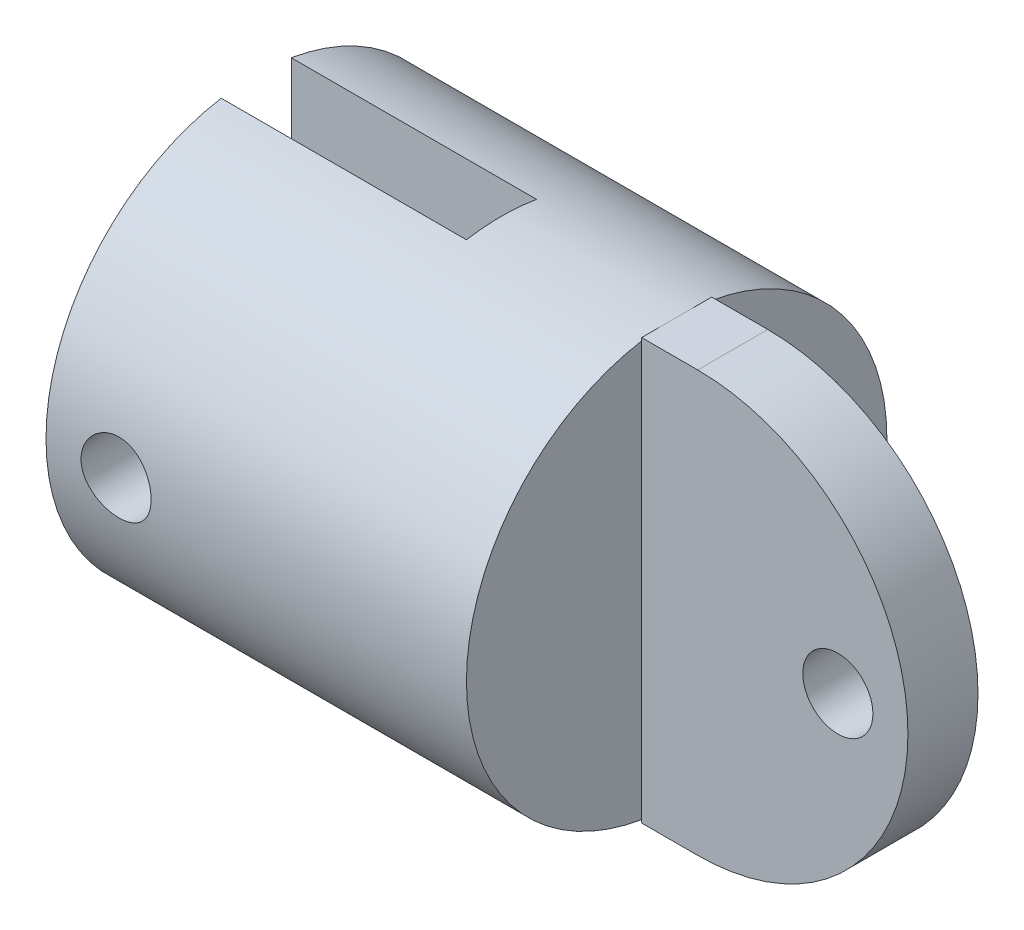
ISO-10303-21;
HEADER;
FILE_DESCRIPTION(('STEP AP214'),'2;1');
FILE_NAME('part.step','',(''),(''),'','','');
FILE_SCHEMA(('AUTOMOTIVE_DESIGN { 1 0 10303 214 1 1 1 1 }'));
ENDSEC;
DATA;
#1=APPLICATION_CONTEXT('core data for automotive mechanical design processes');
#2=APPLICATION_PROTOCOL_DEFINITION('international standard','automotive_design',2000,#1);
#3=PRODUCT_CONTEXT('',#1,'mechanical');
#4=PRODUCT('Part','Part','',(#3));
#5=PRODUCT_RELATED_PRODUCT_CATEGORY('part','',(#4));
#6=PRODUCT_DEFINITION_FORMATION('','',#4);
#7=PRODUCT_DEFINITION_CONTEXT('part definition',#1,'design');
#8=PRODUCT_DEFINITION('design','',#6,#7);
#9=PRODUCT_DEFINITION_SHAPE('','',#8);
#10=(LENGTH_UNIT() NAMED_UNIT(*) SI_UNIT(.MILLI.,.METRE.));
#11=(NAMED_UNIT(*) PLANE_ANGLE_UNIT() SI_UNIT($,.RADIAN.));
#12=(NAMED_UNIT(*) SI_UNIT($,.STERADIAN.) SOLID_ANGLE_UNIT());
#13=UNCERTAINTY_MEASURE_WITH_UNIT(LENGTH_MEASURE(1.E-05),#10,'distance_accuracy_value','');
#14=(GEOMETRIC_REPRESENTATION_CONTEXT(3) GLOBAL_UNCERTAINTY_ASSIGNED_CONTEXT((#13)) GLOBAL_UNIT_ASSIGNED_CONTEXT((#10,
#11,#12)) REPRESENTATION_CONTEXT('',''));
#15=CARTESIAN_POINT('',(0.,0.,0.));
#16=DIRECTION('',(0.,0.,1.));
#17=DIRECTION('',(1.,0.,0.));
#18=AXIS2_PLACEMENT_3D('',#15,#16,#17);
#19=CARTESIAN_POINT('',(0.,0.,0.));
#20=DIRECTION('',(1.,0.,0.));
#21=DIRECTION('',(0.,0.,-1.));
#22=AXIS2_PLACEMENT_3D('',#19,#20,#21);
#23=PLANE('',#22);
#24=DIRECTION('',(0.,1.,0.));
#25=VECTOR('',#24,1.);
#26=CARTESIAN_POINT('',(0.,15.,-2.5));
#27=LINE('',#26,#25);
#28=CARTESIAN_POINT('',(0.,-14.790199457749,-2.5));
#29=VERTEX_POINT('',#28);
#30=CARTESIAN_POINT('',(0.,14.790199457749,-2.5));
#31=VERTEX_POINT('',#30);
#32=EDGE_CURVE('E11',#29,#31,#27,.T.);
#33=ORIENTED_EDGE('',*,*,#32,.F.);
#34=CARTESIAN_POINT('',(0.,0.,0.));
#35=DIRECTION('',(1.,0.,0.));
#36=DIRECTION('',(0.,0.,-1.));
#37=AXIS2_PLACEMENT_3D('',#34,#35,#36);
#38=CIRCLE('',#37,15.);
#39=EDGE_CURVE('E272',#29,#31,#38,.T.);
#40=ORIENTED_EDGE('',*,*,#39,.T.);
#41=EDGE_LOOP('',(#33,#40));
#42=FACE_BOUND('',#41,.T.);
#43=ADVANCED_FACE('F39',(#42),#23,.T.);
#44=CARTESIAN_POINT('',(-30.,0.,0.));
#45=DIRECTION('',(1.,0.,0.));
#46=DIRECTION('',(0.,0.,-1.));
#47=AXIS2_PLACEMENT_3D('',#44,#45,#46);
#48=PLANE('',#47);
#49=CARTESIAN_POINT('',(-30.,0.,0.));
#50=DIRECTION('',(1.,0.,0.));
#51=DIRECTION('',(0.,0.,-1.));
#52=AXIS2_PLACEMENT_3D('',#49,#50,#51);
#53=CIRCLE('',#52,15.);
#54=CARTESIAN_POINT('',(-30.,-14.790199457749,-2.5));
#55=VERTEX_POINT('',#54);
#56=CARTESIAN_POINT('',(-30.,14.790199457749,-2.5));
#57=VERTEX_POINT('',#56);
#58=EDGE_CURVE('E256',#55,#57,#53,.T.);
#59=ORIENTED_EDGE('',*,*,#58,.F.);
#60=DIRECTION('',(0.,1.,0.));
#61=VECTOR('',#60,1.);
#62=CARTESIAN_POINT('',(-30.,0.,-2.5));
#63=LINE('',#62,#61);
#64=EDGE_CURVE('E257',#55,#57,#63,.T.);
#65=ORIENTED_EDGE('',*,*,#64,.T.);
#66=EDGE_LOOP('',(#59,#65));
#67=FACE_BOUND('',#66,.T.);
#68=ADVANCED_FACE('F236',(#67),#48,.F.);
#69=CARTESIAN_POINT('',(-30.,0.,0.));
#70=DIRECTION('',(1.,0.,0.));
#71=DIRECTION('',(0.,0.,-1.));
#72=AXIS2_PLACEMENT_3D('',#69,#70,#71);
#73=CYLINDRICAL_SURFACE('',#72,15.);
#74=CARTESIAN_POINT('',(-22.5,0.,-15.));
#75=CARTESIAN_POINT('',(-22.5000055889478,-0.139390904958215,-14.9999976116882));
#76=CARTESIAN_POINT('',(-22.5116972749689,-0.278857881838821,-14.9980367791303));
#77=CARTESIAN_POINT('',(-22.5581356587653,-0.553880221673043,-14.9904034494139));
#78=CARTESIAN_POINT('',(-22.5929035569116,-0.689431867959247,-14.9847275392389));
#79=CARTESIAN_POINT('',(-22.6844154485927,-0.952604747212644,-14.9703006823645));
#80=CARTESIAN_POINT('',(-22.7411414656406,-1.0802323684319,-14.9615522515919));
#81=CARTESIAN_POINT('',(-22.8749122920524,-1.32414184197794,-14.9419422708207));
#82=CARTESIAN_POINT('',(-22.951954777483,-1.44042498987859,-14.9310809625443));
#83=CARTESIAN_POINT('',(-23.1249550838205,-1.65947261429168,-14.9083331745831));
#84=CARTESIAN_POINT('',(-23.2210691146361,-1.76211290353497,-14.8964387181486));
#85=CARTESIAN_POINT('',(-23.4291479684728,-1.94988849865993,-14.8730262687673));
#86=CARTESIAN_POINT('',(-23.5411137914566,-2.03502269939097,-14.8615082996267));
#87=CARTESIAN_POINT('',(-23.7785709661971,-2.18586712560514,-14.8400756575978));
#88=CARTESIAN_POINT('',(-23.9041413368048,-2.251454552861,-14.8301712909164));
#89=CARTESIAN_POINT('',(-24.1647095643006,-2.36055836541122,-14.8131978979467));
#90=CARTESIAN_POINT('',(-24.2997067836776,-2.40407624156561,-14.8061286801431));
#91=CARTESIAN_POINT('',(-24.5739802748565,-2.46741437778481,-14.7957053684276));
#92=CARTESIAN_POINT('',(-24.7132057365014,-2.4874490291354,-14.792317684857));
#93=CARTESIAN_POINT('',(-24.9930802768835,-2.50391672528988,-14.7895393893665));
#94=CARTESIAN_POINT('',(-25.1337292541673,-2.500351440389,-14.7901484945721));
#95=CARTESIAN_POINT('',(-25.4109278612754,-2.46989509839615,-14.7952642886356));
#96=CARTESIAN_POINT('',(-25.5475048035452,-2.44324488188978,-14.7997307331892));
#97=CARTESIAN_POINT('',(-25.8142213178291,-2.36775314040345,-14.8119949521101));
#98=CARTESIAN_POINT('',(-25.9443606688885,-2.31891085431974,-14.8197928407327));
#99=CARTESIAN_POINT('',(-26.1952288234409,-2.20017724609391,-14.837884793341));
#100=CARTESIAN_POINT('',(-26.3159094060812,-2.13018591387971,-14.8481906710733));
#101=CARTESIAN_POINT('',(-26.5439044005384,-1.97121201755743,-14.8701291841501));
#102=CARTESIAN_POINT('',(-26.6512177324549,-1.88222792065429,-14.8817619265429));
#103=CARTESIAN_POINT('',(-26.8508260858073,-1.68648221215905,-14.9052202787979));
#104=CARTESIAN_POINT('',(-26.9429185185401,-1.57951396387313,-14.9170464923165));
#105=CARTESIAN_POINT('',(-27.1078777626653,-1.35153524898165,-14.9394260139672));
#106=CARTESIAN_POINT('',(-27.1807444501832,-1.23052469190642,-14.9499793138975));
#107=CARTESIAN_POINT('',(-27.3052022271363,-0.977705916166714,-14.9686389289291));
#108=CARTESIAN_POINT('',(-27.3567754193313,-0.845888725564664,-14.9767431840745));
#109=CARTESIAN_POINT('',(-27.436994215246,-0.575298345602734,-14.9895750301266));
#110=CARTESIAN_POINT('',(-27.4656417369737,-0.43652573917947,-14.9943029035047));
#111=CARTESIAN_POINT('',(-27.4989213584611,-0.157709901301625,-14.9998112984269));
#112=CARTESIAN_POINT('',(-27.5038315718056,-0.0177007371510131,-15.0006375301278));
#113=CARTESIAN_POINT('',(-27.4902386555719,0.261139772889886,-14.9983747442117));
#114=CARTESIAN_POINT('',(-27.4717364268663,0.399971163892037,-14.9952858772412));
#115=CARTESIAN_POINT('',(-27.4120751506645,0.671656175546761,-14.985568269382));
#116=CARTESIAN_POINT('',(-27.3710537916099,0.804540868385377,-14.9789610480131));
#117=CARTESIAN_POINT('',(-27.2676654818005,1.06154688486044,-14.9629446445536));
#118=CARTESIAN_POINT('',(-27.2052973323647,1.18566771590972,-14.9535353051202));
#119=CARTESIAN_POINT('',(-27.0603488753032,1.42283068946896,-14.9328451630241));
#120=CARTESIAN_POINT('',(-26.9775948438327,1.53576525093715,-14.9215485588702));
#121=CARTESIAN_POINT('',(-26.7944626846149,1.74624358550269,-14.898384673919));
#122=CARTESIAN_POINT('',(-26.6940832767233,1.84378623969658,-14.8865173517155));
#123=CARTESIAN_POINT('',(-26.4773024519286,2.021742779658,-14.8634017523585));
#124=CARTESIAN_POINT('',(-26.3607458344856,2.10196876111371,-14.8521611613711));
#125=CARTESIAN_POINT('',(-26.1156470308615,2.24170231029498,-14.8317152977788));
#126=CARTESIAN_POINT('',(-25.9871052247725,2.30121053476982,-14.8225099606602));
#127=CARTESIAN_POINT('',(-25.7222102671879,2.39753833147315,-14.807234536977));
#128=CARTESIAN_POINT('',(-25.5858919049695,2.43445143254795,-14.8011515431106));
#129=CARTESIAN_POINT('',(-25.3088798707782,2.48483545377828,-14.7927771683526));
#130=CARTESIAN_POINT('',(-25.1681865802679,2.49830841194617,-14.7904854578272));
#131=CARTESIAN_POINT('',(-24.8882948340376,2.50137286604736,-14.7899673308401));
#132=CARTESIAN_POINT('',(-24.7490996214247,2.49126013612519,-14.7916905650565));
#133=CARTESIAN_POINT('',(-24.4744207519492,2.44807983895685,-14.7988978145373));
#134=CARTESIAN_POINT('',(-24.3389370830581,2.41501234611248,-14.8043818176121));
#135=CARTESIAN_POINT('',(-24.0756415627074,2.3269744895949,-14.8184735628172));
#136=CARTESIAN_POINT('',(-23.947820989944,2.27202959060044,-14.8270776721967));
#137=CARTESIAN_POINT('',(-23.7031643308051,2.14182700391591,-14.8464436892221));
#138=CARTESIAN_POINT('',(-23.5863287896279,2.06656830874857,-14.857205703884));
#139=CARTESIAN_POINT('',(-23.3654644168922,1.89681888437216,-14.8798345404562));
#140=CARTESIAN_POINT('',(-23.2616039832997,1.80211056359365,-14.891712955763));
#141=CARTESIAN_POINT('',(-23.0711483955251,1.59660903138023,-14.9151437236084));
#142=CARTESIAN_POINT('',(-22.9845572313618,1.48581211291264,-14.9266960002655));
#143=CARTESIAN_POINT('',(-22.8305517318,1.25036916964028,-14.9482652964222));
#144=CARTESIAN_POINT('',(-22.763273960687,1.12563278753282,-14.958271162531));
#145=CARTESIAN_POINT('',(-22.6507305153901,0.866513069378984,-14.9755116760178));
#146=CARTESIAN_POINT('',(-22.6054429189203,0.732139494830012,-14.9827490817748));
#147=CARTESIAN_POINT('',(-22.5479947258733,0.497703310045403,-14.9920579083296));
#148=CARTESIAN_POINT('',(-22.530025530384,0.39905883029845,-14.9950202727336));
#149=CARTESIAN_POINT('',(-22.5060262621552,0.200289310319811,-14.9989921598612));
#150=CARTESIAN_POINT('',(-22.4999959838626,0.100164295608495,-15.0000017162064));
#151=CARTESIAN_POINT('',(-22.5,0.,-15.));
#152=B_SPLINE_CURVE_WITH_KNOTS('',3,(#74,#75,#76,#77,#78,#79,#80,#81,#82,#83,#84,#85,#86,#87,
#88,#89,#90,#91,#92,#93,#94,#95,#96,#97,#98,#99,#100,#101,#102,#103,#104,#105,#106,#107,#108,
#109,#110,#111,#112,#113,#114,#115,#116,#117,#118,#119,#120,#121,#122,#123,#124,#125,#126,#127,
#128,#129,#130,#131,#132,#133,#134,#135,#136,#137,#138,#139,#140,#141,#142,#143,#144,#145,#146,
#147,#148,#149,#150,#151),.UNSPECIFIED.,.T.,.F.,(4,2,2,2,2,2,2,2,2,2,2,2,2,2,2,2,2,2,2,2,2,2,2,
2,2,2,2,2,2,2,2,2,2,2,2,2,2,2,4),(0.,0.41780658493851,0.835997545695421,1.25384686702527,
1.67164841267479,2.09302491062332,2.51442800169857,2.9384252082384,3.36239376876182,
3.78246077103424,4.20249804320887,4.61820521760409,5.03392665025382,5.45164556632558,
5.86939820680574,6.29232769911327,6.71525991635848,7.13854688915904,7.56179844521149,
7.98007883491398,8.3983431303586,8.81407807006416,9.22983635826067,9.64926825627025,
10.0687306305428,10.4925382200762,10.9163323737594,11.3383602234177,11.7603513778662,
12.177079095227,12.5938054618813,13.0100481822622,13.4263115502934,13.8475138419339,
14.2688133387897,14.693022316072,15.1168075213007,15.4170424816402,15.7172722727697),.UNSPECIFIED.);
#153=CARTESIAN_POINT('',(-22.5,0.,-15.));
#154=VERTEX_POINT('',#153);
#155=EDGE_CURVE('E204',#154,#154,#152,.T.);
#156=ORIENTED_EDGE('',*,*,#155,.F.);
#157=EDGE_LOOP('',(#156));
#158=FACE_BOUND('',#157,.T.);
#159=CARTESIAN_POINT('',(-22.5,0.,15.));
#160=CARTESIAN_POINT('',(-22.5000055889478,0.139390904958215,14.9999976116882));
#161=CARTESIAN_POINT('',(-22.5116972749689,0.278857881838821,14.9980367791303));
#162=CARTESIAN_POINT('',(-22.5581356587653,0.553880221673043,14.9904034494139));
#163=CARTESIAN_POINT('',(-22.5929035569116,0.689431867959247,14.9847275392389));
#164=CARTESIAN_POINT('',(-22.6844154485927,0.952604747212644,14.9703006823645));
#165=CARTESIAN_POINT('',(-22.7411414656406,1.0802323684319,14.9615522515919));
#166=CARTESIAN_POINT('',(-22.8749122920524,1.32414184197794,14.9419422708207));
#167=CARTESIAN_POINT('',(-22.951954777483,1.44042498987859,14.9310809625443));
#168=CARTESIAN_POINT('',(-23.1249550838205,1.65947261429168,14.9083331745831));
#169=CARTESIAN_POINT('',(-23.2210691146361,1.76211290353497,14.8964387181486));
#170=CARTESIAN_POINT('',(-23.4291479684728,1.94988849865993,14.8730262687673));
#171=CARTESIAN_POINT('',(-23.5411137914566,2.03502269939097,14.8615082996267));
#172=CARTESIAN_POINT('',(-23.7785709661971,2.18586712560514,14.8400756575978));
#173=CARTESIAN_POINT('',(-23.9041413368048,2.251454552861,14.8301712909164));
#174=CARTESIAN_POINT('',(-24.1647095643006,2.36055836541122,14.8131978979467));
#175=CARTESIAN_POINT('',(-24.2997067836776,2.40407624156561,14.8061286801431));
#176=CARTESIAN_POINT('',(-24.5739802748565,2.46741437778481,14.7957053684276));
#177=CARTESIAN_POINT('',(-24.7132057365014,2.4874490291354,14.792317684857));
#178=CARTESIAN_POINT('',(-24.9930802768835,2.50391672528988,14.7895393893665));
#179=CARTESIAN_POINT('',(-25.1337292541673,2.500351440389,14.7901484945721));
#180=CARTESIAN_POINT('',(-25.4109278612754,2.46989509839615,14.7952642886356));
#181=CARTESIAN_POINT('',(-25.5475048035452,2.44324488188978,14.7997307331892));
#182=CARTESIAN_POINT('',(-25.8142213178291,2.36775314040345,14.8119949521101));
#183=CARTESIAN_POINT('',(-25.9443606688885,2.31891085431974,14.8197928407327));
#184=CARTESIAN_POINT('',(-26.1952288234409,2.20017724609391,14.837884793341));
#185=CARTESIAN_POINT('',(-26.3159094060812,2.13018591387971,14.8481906710733));
#186=CARTESIAN_POINT('',(-26.5439044005384,1.97121201755743,14.8701291841501));
#187=CARTESIAN_POINT('',(-26.6512177324549,1.88222792065429,14.8817619265429));
#188=CARTESIAN_POINT('',(-26.8508260858073,1.68648221215905,14.9052202787979));
#189=CARTESIAN_POINT('',(-26.9429185185401,1.57951396387313,14.9170464923165));
#190=CARTESIAN_POINT('',(-27.1078777626653,1.35153524898165,14.9394260139672));
#191=CARTESIAN_POINT('',(-27.1807444501832,1.23052469190642,14.9499793138975));
#192=CARTESIAN_POINT('',(-27.3052022271363,0.977705916166714,14.9686389289291));
#193=CARTESIAN_POINT('',(-27.3567754193313,0.845888725564664,14.9767431840745));
#194=CARTESIAN_POINT('',(-27.436994215246,0.575298345602734,14.9895750301266));
#195=CARTESIAN_POINT('',(-27.4656417369737,0.43652573917947,14.9943029035047));
#196=CARTESIAN_POINT('',(-27.4989213584611,0.157709901301625,14.9998112984269));
#197=CARTESIAN_POINT('',(-27.5038315718056,0.0177007371510131,15.0006375301278));
#198=CARTESIAN_POINT('',(-27.4902386555719,-0.261139772889886,14.9983747442117));
#199=CARTESIAN_POINT('',(-27.4717364268663,-0.399971163892037,14.9952858772412));
#200=CARTESIAN_POINT('',(-27.4120751506645,-0.671656175546761,14.985568269382));
#201=CARTESIAN_POINT('',(-27.3710537916099,-0.804540868385377,14.9789610480131));
#202=CARTESIAN_POINT('',(-27.2676654818005,-1.06154688486044,14.9629446445536));
#203=CARTESIAN_POINT('',(-27.2052973323647,-1.18566771590972,14.9535353051202));
#204=CARTESIAN_POINT('',(-27.0603488753032,-1.42283068946896,14.9328451630241));
#205=CARTESIAN_POINT('',(-26.9775948438327,-1.53576525093715,14.9215485588702));
#206=CARTESIAN_POINT('',(-26.7944626846149,-1.74624358550269,14.898384673919));
#207=CARTESIAN_POINT('',(-26.6940832767233,-1.84378623969658,14.8865173517155));
#208=CARTESIAN_POINT('',(-26.4773024519286,-2.021742779658,14.8634017523585));
#209=CARTESIAN_POINT('',(-26.3607458344856,-2.10196876111371,14.8521611613711));
#210=CARTESIAN_POINT('',(-26.1156470308615,-2.24170231029498,14.8317152977788));
#211=CARTESIAN_POINT('',(-25.9871052247725,-2.30121053476982,14.8225099606602));
#212=CARTESIAN_POINT('',(-25.7222102671879,-2.39753833147315,14.807234536977));
#213=CARTESIAN_POINT('',(-25.5858919049695,-2.43445143254795,14.8011515431106));
#214=CARTESIAN_POINT('',(-25.3088798707782,-2.48483545377828,14.7927771683526));
#215=CARTESIAN_POINT('',(-25.1681865802679,-2.49830841194617,14.7904854578272));
#216=CARTESIAN_POINT('',(-24.8882948340376,-2.50137286604736,14.7899673308401));
#217=CARTESIAN_POINT('',(-24.7490996214247,-2.49126013612519,14.7916905650565));
#218=CARTESIAN_POINT('',(-24.4744207519492,-2.44807983895685,14.7988978145373));
#219=CARTESIAN_POINT('',(-24.3389370830581,-2.41501234611248,14.8043818176121));
#220=CARTESIAN_POINT('',(-24.0756415627074,-2.3269744895949,14.8184735628172));
#221=CARTESIAN_POINT('',(-23.947820989944,-2.27202959060044,14.8270776721967));
#222=CARTESIAN_POINT('',(-23.7031643308051,-2.14182700391591,14.8464436892221));
#223=CARTESIAN_POINT('',(-23.5863287896279,-2.06656830874857,14.857205703884));
#224=CARTESIAN_POINT('',(-23.3654644168922,-1.89681888437216,14.8798345404562));
#225=CARTESIAN_POINT('',(-23.2616039832997,-1.80211056359365,14.891712955763));
#226=CARTESIAN_POINT('',(-23.0711483955251,-1.59660903138023,14.9151437236084));
#227=CARTESIAN_POINT('',(-22.9845572313618,-1.48581211291264,14.9266960002655));
#228=CARTESIAN_POINT('',(-22.8305517318,-1.25036916964028,14.9482652964222));
#229=CARTESIAN_POINT('',(-22.763273960687,-1.12563278753282,14.958271162531));
#230=CARTESIAN_POINT('',(-22.6507305153901,-0.866513069378984,14.9755116760178));
#231=CARTESIAN_POINT('',(-22.6054429189203,-0.732139494830012,14.9827490817748));
#232=CARTESIAN_POINT('',(-22.5479947258733,-0.497703310045403,14.9920579083296));
#233=CARTESIAN_POINT('',(-22.530025530384,-0.39905883029845,14.9950202727336));
#234=CARTESIAN_POINT('',(-22.5060262621552,-0.200289310319811,14.9989921598612));
#235=CARTESIAN_POINT('',(-22.4999959838626,-0.100164295608495,15.0000017162064));
#236=CARTESIAN_POINT('',(-22.5,0.,15.));
#237=B_SPLINE_CURVE_WITH_KNOTS('',3,(#159,#160,#161,#162,#163,#164,#165,#166,#167,#168,#169,
#170,#171,#172,#173,#174,#175,#176,#177,#178,#179,#180,#181,#182,#183,#184,#185,#186,#187,#188,
#189,#190,#191,#192,#193,#194,#195,#196,#197,#198,#199,#200,#201,#202,#203,#204,#205,#206,#207,
#208,#209,#210,#211,#212,#213,#214,#215,#216,#217,#218,#219,#220,#221,#222,#223,#224,#225,#226,
#227,#228,#229,#230,#231,#232,#233,#234,#235,#236),.UNSPECIFIED.,.T.,.F.,(4,2,2,2,2,2,2,2,2,2,2,
2,2,2,2,2,2,2,2,2,2,2,2,2,2,2,2,2,2,2,2,2,2,2,2,2,2,2,4),(0.,0.41780658493851,0.835997545695421,
1.25384686702527,1.67164841267479,2.09302491062332,2.51442800169857,2.9384252082384,
3.36239376876182,3.78246077103424,4.20249804320887,4.61820521760409,5.03392665025382,
5.45164556632558,5.86939820680574,6.29232769911327,6.71525991635848,7.13854688915904,
7.56179844521149,7.98007883491398,8.3983431303586,8.81407807006416,9.22983635826067,
9.64926825627025,10.0687306305428,10.4925382200762,10.9163323737594,11.3383602234177,
11.7603513778662,12.177079095227,12.5938054618813,13.0100481822622,13.4263115502934,
13.8475138419339,14.2688133387897,14.693022316072,15.1168075213007,15.4170424816402,
15.7172722727697),.UNSPECIFIED.);
#238=CARTESIAN_POINT('',(-22.5,0.,15.));
#239=VERTEX_POINT('',#238);
#240=EDGE_CURVE('E196',#239,#239,#237,.T.);
#241=ORIENTED_EDGE('',*,*,#240,.F.);
#242=EDGE_LOOP('',(#241));
#243=FACE_BOUND('',#242,.T.);
#244=DIRECTION('',(1.,0.,0.));
#245=VECTOR('',#244,1.);
#246=CARTESIAN_POINT('',(-30.,-14.790199457749,-2.5));
#247=LINE('',#246,#245);
#248=CARTESIAN_POINT('',(-12.5,-14.790199457749,-2.5));
#249=VERTEX_POINT('',#248);
#250=EDGE_CURVE('E297',#55,#249,#247,.T.);
#251=ORIENTED_EDGE('',*,*,#250,.F.);
#252=ORIENTED_EDGE('',*,*,#58,.T.);
#253=DIRECTION('',(1.,0.,0.));
#254=VECTOR('',#253,1.);
#255=CARTESIAN_POINT('',(-30.,14.790199457749,-2.5));
#256=LINE('',#255,#254);
#257=CARTESIAN_POINT('',(-12.5,14.790199457749,-2.5));
#258=VERTEX_POINT('',#257);
#259=EDGE_CURVE('E274',#258,#57,#256,.F.);
#260=ORIENTED_EDGE('',*,*,#259,.F.);
#261=CARTESIAN_POINT('',(-12.5,0.,0.));
#262=DIRECTION('',(1.,0.,0.));
#263=DIRECTION('',(0.,0.,-1.));
#264=AXIS2_PLACEMENT_3D('',#261,#262,#263);
#265=CIRCLE('',#264,15.);
#266=CARTESIAN_POINT('',(-12.5,14.790199457749,2.5));
#267=VERTEX_POINT('',#266);
#268=EDGE_CURVE('E282',#267,#258,#265,.F.);
#269=ORIENTED_EDGE('',*,*,#268,.F.);
#270=DIRECTION('',(1.,0.,0.));
#271=VECTOR('',#270,1.);
#272=CARTESIAN_POINT('',(-30.,14.790199457749,2.5));
#273=LINE('',#272,#271);
#274=CARTESIAN_POINT('',(-30.,14.790199457749,2.5));
#275=VERTEX_POINT('',#274);
#276=EDGE_CURVE('E324',#275,#267,#273,.T.);
#277=ORIENTED_EDGE('',*,*,#276,.F.);
#278=CARTESIAN_POINT('',(-30.,-14.790199457749,2.5));
#279=VERTEX_POINT('',#278);
#280=EDGE_CURVE('E262',#275,#279,#53,.T.);
#281=ORIENTED_EDGE('',*,*,#280,.T.);
#282=DIRECTION('',(1.,0.,0.));
#283=VECTOR('',#282,1.);
#284=CARTESIAN_POINT('',(-30.,-14.790199457749,2.5));
#285=LINE('',#284,#283);
#286=CARTESIAN_POINT('',(-12.5,-14.790199457749,2.5));
#287=VERTEX_POINT('',#286);
#288=EDGE_CURVE('E321',#287,#279,#285,.F.);
#289=ORIENTED_EDGE('',*,*,#288,.F.);
#290=EDGE_CURVE('E284',#249,#287,#265,.F.);
#291=ORIENTED_EDGE('',*,*,#290,.F.);
#292=EDGE_LOOP('',(#251,#252,#260,#269,#277,#281,#289,#291));
#293=FACE_BOUND('',#292,.T.);
#294=CARTESIAN_POINT('',(0.,15.,0.));
#295=VERTEX_POINT('',#294);
#296=EDGE_CURVE('E263',#31,#295,#38,.T.);
#297=ORIENTED_EDGE('',*,*,#296,.F.);
#298=ORIENTED_EDGE('',*,*,#39,.F.);
#299=CARTESIAN_POINT('',(0.,-15.,0.));
#300=VERTEX_POINT('',#299);
#301=EDGE_CURVE('E64',#300,#29,#38,.T.);
#302=ORIENTED_EDGE('',*,*,#301,.F.);
#303=CARTESIAN_POINT('',(0.,-14.790199457749,2.5));
#304=VERTEX_POINT('',#303);
#305=EDGE_CURVE('E313',#304,#300,#38,.T.);
#306=ORIENTED_EDGE('',*,*,#305,.F.);
#307=CARTESIAN_POINT('',(0.,14.790199457749,2.5));
#308=VERTEX_POINT('',#307);
#309=EDGE_CURVE('E316',#308,#304,#38,.T.);
#310=ORIENTED_EDGE('',*,*,#309,.F.);
#311=EDGE_CURVE('E270',#295,#308,#38,.T.);
#312=ORIENTED_EDGE('',*,*,#311,.F.);
#313=EDGE_LOOP('',(#297,#298,#302,#306,#310,#312));
#314=FACE_BOUND('',#313,.T.);
#315=ADVANCED_FACE('F41',(#158,#243,#293,#314),#73,.T.);
#316=ORIENTED_EDGE('',*,*,#280,.F.);
#317=DIRECTION('',(0.,-1.,0.));
#318=VECTOR('',#317,1.);
#319=CARTESIAN_POINT('',(-30.,0.,2.5));
#320=LINE('',#319,#318);
#321=EDGE_CURVE('E268',#275,#279,#320,.T.);
#322=ORIENTED_EDGE('',*,*,#321,.T.);
#323=EDGE_LOOP('',(#316,#322));
#324=FACE_BOUND('',#323,.T.);
#325=ADVANCED_FACE('F233',(#324),#48,.F.);
#326=DIRECTION('',(0.,-1.,0.));
#327=VECTOR('',#326,1.);
#328=CARTESIAN_POINT('',(0.,15.,2.5));
#329=LINE('',#328,#327);
#330=EDGE_CURVE('E50',#308,#304,#329,.T.);
#331=ORIENTED_EDGE('',*,*,#330,.F.);
#332=ORIENTED_EDGE('',*,*,#309,.T.);
#333=EDGE_LOOP('',(#331,#332));
#334=FACE_BOUND('',#333,.T.);
#335=ADVANCED_FACE('F224',(#334),#23,.T.);
#336=CARTESIAN_POINT('',(-30.,-15.,-2.5));
#337=DIRECTION('',(0.,0.,-1.));
#338=DIRECTION('',(-1.,0.,0.));
#339=AXIS2_PLACEMENT_3D('',#336,#337,#338);
#340=PLANE('',#339);
#341=CARTESIAN_POINT('',(-25.,0.,-2.5));
#342=DIRECTION('',(0.,0.,-1.));
#343=DIRECTION('',(-1.,0.,0.));
#344=AXIS2_PLACEMENT_3D('',#341,#342,#343);
#345=CIRCLE('',#344,2.5);
#346=CARTESIAN_POINT('',(-27.5,0.,-2.5));
#347=VERTEX_POINT('',#346);
#348=EDGE_CURVE('E192',#347,#347,#345,.T.);
#349=ORIENTED_EDGE('',*,*,#348,.T.);
#350=EDGE_LOOP('',(#349));
#351=FACE_BOUND('',#350,.T.);
#352=ORIENTED_EDGE('',*,*,#259,.T.);
#353=ORIENTED_EDGE('',*,*,#64,.F.);
#354=ORIENTED_EDGE('',*,*,#250,.T.);
#355=DIRECTION('',(0.,1.,0.));
#356=VECTOR('',#355,1.);
#357=CARTESIAN_POINT('',(-12.5,-15.,-2.5));
#358=LINE('',#357,#356);
#359=EDGE_CURVE('E330',#249,#258,#358,.T.);
#360=ORIENTED_EDGE('',*,*,#359,.T.);
#361=EDGE_LOOP('',(#352,#353,#354,#360));
#362=FACE_BOUND('',#361,.T.);
#363=ADVANCED_FACE('F219',(#351,#362),#340,.F.);
#364=CARTESIAN_POINT('',(-12.5,-15.,-2.5));
#365=DIRECTION('',(1.,0.,0.));
#366=DIRECTION('',(0.,0.,-1.));
#367=AXIS2_PLACEMENT_3D('',#364,#365,#366);
#368=PLANE('',#367);
#369=ORIENTED_EDGE('',*,*,#359,.F.);
#370=ORIENTED_EDGE('',*,*,#290,.T.);
#371=DIRECTION('',(0.,1.,0.));
#372=VECTOR('',#371,1.);
#373=CARTESIAN_POINT('',(-12.5,-15.,2.5));
#374=LINE('',#373,#372);
#375=EDGE_CURVE('E331',#287,#267,#374,.T.);
#376=ORIENTED_EDGE('',*,*,#375,.T.);
#377=ORIENTED_EDGE('',*,*,#268,.T.);
#378=EDGE_LOOP('',(#369,#370,#376,#377));
#379=FACE_BOUND('',#378,.T.);
#380=ADVANCED_FACE('F223',(#379),#368,.F.);
#381=CARTESIAN_POINT('',(-30.,-15.,2.5));
#382=DIRECTION('',(0.,0.,1.));
#383=DIRECTION('',(1.,0.,0.));
#384=AXIS2_PLACEMENT_3D('',#381,#382,#383);
#385=PLANE('',#384);
#386=CARTESIAN_POINT('',(-25.,0.,2.5));
#387=DIRECTION('',(0.,0.,1.));
#388=DIRECTION('',(1.,0.,0.));
#389=AXIS2_PLACEMENT_3D('',#386,#387,#388);
#390=CIRCLE('',#389,2.5);
#391=CARTESIAN_POINT('',(-22.5,0.,2.5));
#392=VERTEX_POINT('',#391);
#393=EDGE_CURVE('E191',#392,#392,#390,.T.);
#394=ORIENTED_EDGE('',*,*,#393,.T.);
#395=EDGE_LOOP('',(#394));
#396=FACE_BOUND('',#395,.T.);
#397=ORIENTED_EDGE('',*,*,#288,.T.);
#398=ORIENTED_EDGE('',*,*,#321,.F.);
#399=ORIENTED_EDGE('',*,*,#276,.T.);
#400=ORIENTED_EDGE('',*,*,#375,.F.);
#401=EDGE_LOOP('',(#397,#398,#399,#400));
#402=FACE_BOUND('',#401,.T.);
#403=ADVANCED_FACE('F228',(#396,#402),#385,.F.);
#404=CARTESIAN_POINT('',(-25.,0.,-15.));
#405=DIRECTION('',(0.,0.,1.));
#406=DIRECTION('',(1.,0.,0.));
#407=AXIS2_PLACEMENT_3D('',#404,#405,#406);
#408=CYLINDRICAL_SURFACE('',#407,2.5);
#409=ORIENTED_EDGE('',*,*,#240,.T.);
#410=EDGE_LOOP('',(#409));
#411=FACE_BOUND('',#410,.T.);
#412=ORIENTED_EDGE('',*,*,#393,.F.);
#413=EDGE_LOOP('',(#412));
#414=FACE_BOUND('',#413,.T.);
#415=ADVANCED_FACE('F215',(#411,#414),#408,.F.);
#416=ORIENTED_EDGE('',*,*,#155,.T.);
#417=EDGE_LOOP('',(#416));
#418=FACE_BOUND('',#417,.T.);
#419=ORIENTED_EDGE('',*,*,#348,.F.);
#420=EDGE_LOOP('',(#419));
#421=FACE_BOUND('',#420,.T.);
#422=ADVANCED_FACE('F209',(#418,#421),#408,.F.);
#423=CARTESIAN_POINT('',(0.,0.,0.));
#424=DIRECTION('',(-1.,0.,0.));
#425=DIRECTION('',(0.,0.,1.));
#426=AXIS2_PLACEMENT_3D('',#423,#424,#425);
#427=PLANE('',#426);
#428=CARTESIAN_POINT('',(0.,15.,-2.5));
#429=VERTEX_POINT('',#428);
#430=EDGE_CURVE('E53',#31,#429,#27,.T.);
#431=ORIENTED_EDGE('',*,*,#430,.F.);
#432=ORIENTED_EDGE('',*,*,#296,.T.);
#433=DIRECTION('',(0.,0.,1.));
#434=VECTOR('',#433,1.);
#435=CARTESIAN_POINT('',(0.,15.,2.5));
#436=LINE('',#435,#434);
#437=EDGE_CURVE('E171',#429,#295,#436,.T.);
#438=ORIENTED_EDGE('',*,*,#437,.F.);
#439=EDGE_LOOP('',(#431,#432,#438));
#440=FACE_BOUND('',#439,.T.);
#441=ADVANCED_FACE('F214',(#440),#427,.T.);
#442=CARTESIAN_POINT('',(0.,15.,2.5));
#443=VERTEX_POINT('',#442);
#444=EDGE_CURVE('E164',#295,#443,#436,.T.);
#445=ORIENTED_EDGE('',*,*,#444,.F.);
#446=ORIENTED_EDGE('',*,*,#311,.T.);
#447=EDGE_CURVE('E175',#443,#308,#329,.T.);
#448=ORIENTED_EDGE('',*,*,#447,.F.);
#449=EDGE_LOOP('',(#445,#446,#448));
#450=FACE_BOUND('',#449,.T.);
#451=ADVANCED_FACE('F347',(#450),#427,.T.);
#452=CARTESIAN_POINT('',(0.,-15.,2.5));
#453=VERTEX_POINT('',#452);
#454=EDGE_CURVE('E151',#304,#453,#329,.T.);
#455=ORIENTED_EDGE('',*,*,#454,.F.);
#456=ORIENTED_EDGE('',*,*,#305,.T.);
#457=DIRECTION('',(0.,0.,-1.));
#458=VECTOR('',#457,1.);
#459=CARTESIAN_POINT('',(0.,-15.,2.5));
#460=LINE('',#459,#458);
#461=EDGE_CURVE('E179',#453,#300,#460,.T.);
#462=ORIENTED_EDGE('',*,*,#461,.F.);
#463=EDGE_LOOP('',(#455,#456,#462));
#464=FACE_BOUND('',#463,.T.);
#465=ADVANCED_FACE('F351',(#464),#427,.T.);
#466=CARTESIAN_POINT('',(4.,15.,2.5));
#467=DIRECTION('',(0.,-1.,0.));
#468=DIRECTION('',(0.,0.,-1.));
#469=AXIS2_PLACEMENT_3D('',#466,#467,#468);
#470=PLANE('',#469);
#471=ORIENTED_EDGE('',*,*,#437,.T.);
#472=ORIENTED_EDGE('',*,*,#444,.T.);
#473=DIRECTION('',(-1.,0.,0.));
#474=VECTOR('',#473,1.);
#475=CARTESIAN_POINT('',(4.,15.,2.5));
#476=LINE('',#475,#474);
#477=CARTESIAN_POINT('',(4.,15.,2.5));
#478=VERTEX_POINT('',#477);
#479=EDGE_CURVE('E153',#478,#443,#476,.T.);
#480=ORIENTED_EDGE('',*,*,#479,.F.);
#481=DIRECTION('',(0.,0.,1.));
#482=VECTOR('',#481,1.);
#483=CARTESIAN_POINT('',(4.,15.,2.5));
#484=LINE('',#483,#482);
#485=CARTESIAN_POINT('',(4.,15.,-2.5));
#486=VERTEX_POINT('',#485);
#487=EDGE_CURVE('E141',#486,#478,#484,.T.);
#488=ORIENTED_EDGE('',*,*,#487,.F.);
#489=DIRECTION('',(-1.,0.,0.));
#490=VECTOR('',#489,1.);
#491=CARTESIAN_POINT('',(4.,15.,-2.5));
#492=LINE('',#491,#490);
#493=EDGE_CURVE('E140',#486,#429,#492,.T.);
#494=ORIENTED_EDGE('',*,*,#493,.T.);
#495=EDGE_LOOP('',(#471,#472,#480,#488,#494));
#496=FACE_BOUND('',#495,.T.);
#497=ADVANCED_FACE('F217',(#496),#470,.F.);
#498=CARTESIAN_POINT('',(4.,15.,2.5));
#499=DIRECTION('',(0.,0.,-1.));
#500=DIRECTION('',(0.,1.,0.));
#501=AXIS2_PLACEMENT_3D('',#498,#499,#500);
#502=PLANE('',#501);
#503=CARTESIAN_POINT('',(14.,0.,2.5));
#504=DIRECTION('',(0.,0.,-1.));
#505=DIRECTION('',(0.,1.,0.));
#506=AXIS2_PLACEMENT_3D('',#503,#504,#505);
#507=CIRCLE('',#506,2.5);
#508=CARTESIAN_POINT('',(14.,2.5,2.5));
#509=VERTEX_POINT('',#508);
#510=EDGE_CURVE('E160',#509,#509,#507,.T.);
#511=ORIENTED_EDGE('',*,*,#510,.T.);
#512=EDGE_LOOP('',(#511));
#513=FACE_BOUND('',#512,.T.);
#514=ORIENTED_EDGE('',*,*,#447,.T.);
#515=ORIENTED_EDGE('',*,*,#330,.T.);
#516=ORIENTED_EDGE('',*,*,#454,.T.);
#517=DIRECTION('',(-1.,0.,0.));
#518=VECTOR('',#517,1.);
#519=CARTESIAN_POINT('',(4.,-15.,2.5));
#520=LINE('',#519,#518);
#521=CARTESIAN_POINT('',(4.,-15.,2.5));
#522=VERTEX_POINT('',#521);
#523=EDGE_CURVE('E131',#522,#453,#520,.T.);
#524=ORIENTED_EDGE('',*,*,#523,.F.);
#525=CARTESIAN_POINT('',(4.,0.,2.5));
#526=DIRECTION('',(0.,0.,1.));
#527=DIRECTION('',(1.,0.,0.));
#528=AXIS2_PLACEMENT_3D('',#525,#526,#527);
#529=CIRCLE('',#528,15.);
#530=EDGE_CURVE('E148',#522,#478,#529,.T.);
#531=ORIENTED_EDGE('',*,*,#530,.T.);
#532=ORIENTED_EDGE('',*,*,#479,.T.);
#533=EDGE_LOOP('',(#514,#515,#516,#524,#531,#532));
#534=FACE_BOUND('',#533,.T.);
#535=ADVANCED_FACE('F146',(#513,#534),#502,.F.);
#536=CARTESIAN_POINT('',(4.,-15.,2.5));
#537=DIRECTION('',(0.,1.,0.));
#538=DIRECTION('',(0.,0.,1.));
#539=AXIS2_PLACEMENT_3D('',#536,#537,#538);
#540=PLANE('',#539);
#541=ORIENTED_EDGE('',*,*,#461,.T.);
#542=CARTESIAN_POINT('',(0.,-15.,-2.5));
#543=VERTEX_POINT('',#542);
#544=EDGE_CURVE('E178',#300,#543,#460,.T.);
#545=ORIENTED_EDGE('',*,*,#544,.T.);
#546=DIRECTION('',(-1.,0.,0.));
#547=VECTOR('',#546,1.);
#548=CARTESIAN_POINT('',(4.,-15.,-2.5));
#549=LINE('',#548,#547);
#550=CARTESIAN_POINT('',(4.,-15.,-2.5));
#551=VERTEX_POINT('',#550);
#552=EDGE_CURVE('E134',#551,#543,#549,.T.);
#553=ORIENTED_EDGE('',*,*,#552,.F.);
#554=DIRECTION('',(0.,0.,-1.));
#555=VECTOR('',#554,1.);
#556=CARTESIAN_POINT('',(4.,-15.,2.5));
#557=LINE('',#556,#555);
#558=EDGE_CURVE('E127',#522,#551,#557,.T.);
#559=ORIENTED_EDGE('',*,*,#558,.F.);
#560=ORIENTED_EDGE('',*,*,#523,.T.);
#561=EDGE_LOOP('',(#541,#545,#553,#559,#560));
#562=FACE_BOUND('',#561,.T.);
#563=ADVANCED_FACE('F130',(#562),#540,.F.);
#564=CARTESIAN_POINT('',(4.,15.,-2.5));
#565=DIRECTION('',(0.,0.,1.));
#566=DIRECTION('',(0.,-1.,0.));
#567=AXIS2_PLACEMENT_3D('',#564,#565,#566);
#568=PLANE('',#567);
#569=CARTESIAN_POINT('',(14.,0.,-2.5));
#570=DIRECTION('',(0.,0.,1.));
#571=DIRECTION('',(0.,-1.,0.));
#572=AXIS2_PLACEMENT_3D('',#569,#570,#571);
#573=CIRCLE('',#572,2.5);
#574=CARTESIAN_POINT('',(14.,-2.5,-2.5));
#575=VERTEX_POINT('',#574);
#576=EDGE_CURVE('E44',#575,#575,#573,.T.);
#577=ORIENTED_EDGE('',*,*,#576,.T.);
#578=EDGE_LOOP('',(#577));
#579=FACE_BOUND('',#578,.T.);
#580=EDGE_CURVE('E52',#543,#29,#27,.T.);
#581=ORIENTED_EDGE('',*,*,#580,.T.);
#582=ORIENTED_EDGE('',*,*,#32,.T.);
#583=ORIENTED_EDGE('',*,*,#430,.T.);
#584=ORIENTED_EDGE('',*,*,#493,.F.);
#585=CARTESIAN_POINT('',(4.,0.,-2.5));
#586=DIRECTION('',(0.,0.,1.));
#587=DIRECTION('',(1.,0.,0.));
#588=AXIS2_PLACEMENT_3D('',#585,#586,#587);
#589=CIRCLE('',#588,15.);
#590=EDGE_CURVE('E159',#551,#486,#589,.T.);
#591=ORIENTED_EDGE('',*,*,#590,.F.);
#592=ORIENTED_EDGE('',*,*,#552,.T.);
#593=EDGE_LOOP('',(#581,#582,#583,#584,#591,#592));
#594=FACE_BOUND('',#593,.T.);
#595=ADVANCED_FACE('F307',(#579,#594),#568,.F.);
#596=ORIENTED_EDGE('',*,*,#544,.F.);
#597=ORIENTED_EDGE('',*,*,#301,.T.);
#598=ORIENTED_EDGE('',*,*,#580,.F.);
#599=EDGE_LOOP('',(#596,#597,#598));
#600=FACE_BOUND('',#599,.T.);
#601=ADVANCED_FACE('F311',(#600),#427,.T.);
#602=CARTESIAN_POINT('',(4.,0.,-2.5));
#603=DIRECTION('',(0.,0.,1.));
#604=DIRECTION('',(1.,0.,0.));
#605=AXIS2_PLACEMENT_3D('',#602,#603,#604);
#606=CYLINDRICAL_SURFACE('',#605,15.);
#607=ORIENTED_EDGE('',*,*,#530,.F.);
#608=ORIENTED_EDGE('',*,*,#558,.T.);
#609=ORIENTED_EDGE('',*,*,#590,.T.);
#610=ORIENTED_EDGE('',*,*,#487,.T.);
#611=EDGE_LOOP('',(#607,#608,#609,#610));
#612=FACE_BOUND('',#611,.T.);
#613=ADVANCED_FACE('F156',(#612),#606,.T.);
#614=CARTESIAN_POINT('',(14.,0.,-15.));
#615=DIRECTION('',(0.,0.,1.));
#616=DIRECTION('',(1.,0.,0.));
#617=AXIS2_PLACEMENT_3D('',#614,#615,#616);
#618=CYLINDRICAL_SURFACE('',#617,2.5);
#619=ORIENTED_EDGE('',*,*,#576,.F.);
#620=EDGE_LOOP('',(#619));
#621=FACE_BOUND('',#620,.T.);
#622=ORIENTED_EDGE('',*,*,#510,.F.);
#623=EDGE_LOOP('',(#622));
#624=FACE_BOUND('',#623,.T.);
#625=ADVANCED_FACE('F365',(#621,#624),#618,.F.);
#626=CLOSED_SHELL('',(#43,#68,#315,#325,#335,#363,#380,#403,#415,#422,#441,#451,#465,#497,#535,
#563,#595,#601,#613,#625));
#627=MANIFOLD_SOLID_BREP('B2',#626);
#628=ADVANCED_BREP_SHAPE_REPRESENTATION('',(#18,#627),#14);
#629=SHAPE_DEFINITION_REPRESENTATION(#9,#628);
ENDSEC;
END-ISO-10303-21;
